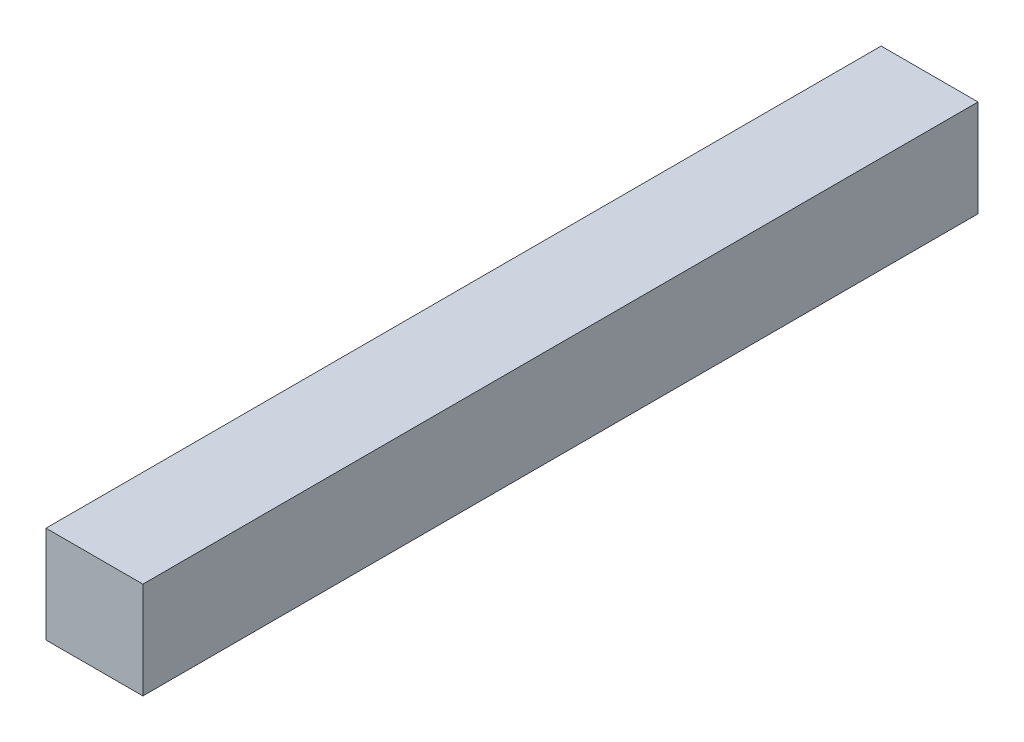
ISO-10303-21;
HEADER;
FILE_DESCRIPTION(('STEP AP214'),'2;1');
FILE_NAME('part.step','',(''),(''),'','','');
FILE_SCHEMA(('AUTOMOTIVE_DESIGN { 1 0 10303 214 1 1 1 1 }'));
ENDSEC;
DATA;
#1=APPLICATION_CONTEXT('core data for automotive mechanical design processes');
#2=APPLICATION_PROTOCOL_DEFINITION('international standard','automotive_design',2000,#1);
#3=PRODUCT_CONTEXT('',#1,'mechanical');
#4=PRODUCT('Part','Part','',(#3));
#5=PRODUCT_RELATED_PRODUCT_CATEGORY('part','',(#4));
#6=PRODUCT_DEFINITION_FORMATION('','',#4);
#7=PRODUCT_DEFINITION_CONTEXT('part definition',#1,'design');
#8=PRODUCT_DEFINITION('design','',#6,#7);
#9=PRODUCT_DEFINITION_SHAPE('','',#8);
#10=(LENGTH_UNIT() NAMED_UNIT(*) SI_UNIT(.MILLI.,.METRE.));
#11=(NAMED_UNIT(*) PLANE_ANGLE_UNIT() SI_UNIT($,.RADIAN.));
#12=(NAMED_UNIT(*) SI_UNIT($,.STERADIAN.) SOLID_ANGLE_UNIT());
#13=UNCERTAINTY_MEASURE_WITH_UNIT(LENGTH_MEASURE(1.E-05),#10,'distance_accuracy_value','');
#14=(GEOMETRIC_REPRESENTATION_CONTEXT(3) GLOBAL_UNCERTAINTY_ASSIGNED_CONTEXT((#13)) GLOBAL_UNIT_ASSIGNED_CONTEXT((#10,
#11,#12)) REPRESENTATION_CONTEXT('',''));
#15=CARTESIAN_POINT('',(0.,0.,0.));
#16=DIRECTION('',(0.,0.,1.));
#17=DIRECTION('',(1.,0.,0.));
#18=AXIS2_PLACEMENT_3D('',#15,#16,#17);
#19=CARTESIAN_POINT('',(3.625,3.625,62.5));
#20=DIRECTION('',(-1.,0.,0.));
#21=DIRECTION('',(0.,-1.,0.));
#22=AXIS2_PLACEMENT_3D('',#19,#20,#21);
#23=PLANE('',#22);
#24=DIRECTION('',(0.,1.,0.));
#25=VECTOR('',#24,1.);
#26=CARTESIAN_POINT('',(3.625,3.625,0.));
#27=LINE('',#26,#25);
#28=CARTESIAN_POINT('',(3.625,-3.625,0.));
#29=VERTEX_POINT('',#28);
#30=CARTESIAN_POINT('',(3.625,3.625,0.));
#31=VERTEX_POINT('',#30);
#32=EDGE_CURVE('E113',#29,#31,#27,.T.);
#33=ORIENTED_EDGE('',*,*,#32,.T.);
#34=DIRECTION('',(0.,0.,-1.));
#35=VECTOR('',#34,1.);
#36=CARTESIAN_POINT('',(3.625,3.625,62.5));
#37=LINE('',#36,#35);
#38=CARTESIAN_POINT('',(3.625,3.625,62.5));
#39=VERTEX_POINT('',#38);
#40=EDGE_CURVE('E11',#39,#31,#37,.T.);
#41=ORIENTED_EDGE('',*,*,#40,.F.);
#42=DIRECTION('',(0.,1.,0.));
#43=VECTOR('',#42,1.);
#44=CARTESIAN_POINT('',(3.625,3.625,62.5));
#45=LINE('',#44,#43);
#46=CARTESIAN_POINT('',(3.625,-3.625,62.5));
#47=VERTEX_POINT('',#46);
#48=EDGE_CURVE('E97',#47,#39,#45,.T.);
#49=ORIENTED_EDGE('',*,*,#48,.F.);
#50=DIRECTION('',(0.,0.,-1.));
#51=VECTOR('',#50,1.);
#52=CARTESIAN_POINT('',(3.625,-3.625,62.5));
#53=LINE('',#52,#51);
#54=EDGE_CURVE('E109',#47,#29,#53,.T.);
#55=ORIENTED_EDGE('',*,*,#54,.T.);
#56=EDGE_LOOP('',(#33,#41,#49,#55));
#57=FACE_BOUND('',#56,.T.);
#58=ADVANCED_FACE('F45',(#57),#23,.F.);
#59=CARTESIAN_POINT('',(-3.625,3.625,62.5));
#60=DIRECTION('',(0.,-1.,0.));
#61=DIRECTION('',(0.,0.,-1.));
#62=AXIS2_PLACEMENT_3D('',#59,#60,#61);
#63=PLANE('',#62);
#64=DIRECTION('',(-1.,0.,0.));
#65=VECTOR('',#64,1.);
#66=CARTESIAN_POINT('',(-3.625,3.625,0.));
#67=LINE('',#66,#65);
#68=CARTESIAN_POINT('',(-3.625,3.625,0.));
#69=VERTEX_POINT('',#68);
#70=EDGE_CURVE('E102',#31,#69,#67,.T.);
#71=ORIENTED_EDGE('',*,*,#70,.T.);
#72=DIRECTION('',(0.,0.,-1.));
#73=VECTOR('',#72,1.);
#74=CARTESIAN_POINT('',(-3.625,3.625,62.5));
#75=LINE('',#74,#73);
#76=CARTESIAN_POINT('',(-3.625,3.625,62.5));
#77=VERTEX_POINT('',#76);
#78=EDGE_CURVE('E54',#77,#69,#75,.T.);
#79=ORIENTED_EDGE('',*,*,#78,.F.);
#80=DIRECTION('',(-1.,0.,0.));
#81=VECTOR('',#80,1.);
#82=CARTESIAN_POINT('',(-3.625,3.625,62.5));
#83=LINE('',#82,#81);
#84=EDGE_CURVE('E92',#39,#77,#83,.T.);
#85=ORIENTED_EDGE('',*,*,#84,.F.);
#86=ORIENTED_EDGE('',*,*,#40,.T.);
#87=EDGE_LOOP('',(#71,#79,#85,#86));
#88=FACE_BOUND('',#87,.T.);
#89=ADVANCED_FACE('F101',(#88),#63,.F.);
#90=CARTESIAN_POINT('',(-3.625,3.625,62.5));
#91=DIRECTION('',(1.,0.,0.));
#92=DIRECTION('',(0.,1.,0.));
#93=AXIS2_PLACEMENT_3D('',#90,#91,#92);
#94=PLANE('',#93);
#95=DIRECTION('',(0.,-1.,0.));
#96=VECTOR('',#95,1.);
#97=CARTESIAN_POINT('',(-3.625,3.625,0.));
#98=LINE('',#97,#96);
#99=CARTESIAN_POINT('',(-3.625,-3.625,0.));
#100=VERTEX_POINT('',#99);
#101=EDGE_CURVE('E79',#69,#100,#98,.T.);
#102=ORIENTED_EDGE('',*,*,#101,.T.);
#103=DIRECTION('',(0.,0.,-1.));
#104=VECTOR('',#103,1.);
#105=CARTESIAN_POINT('',(-3.625,-3.625,62.5));
#106=LINE('',#105,#104);
#107=CARTESIAN_POINT('',(-3.625,-3.625,62.5));
#108=VERTEX_POINT('',#107);
#109=EDGE_CURVE('E104',#108,#100,#106,.T.);
#110=ORIENTED_EDGE('',*,*,#109,.F.);
#111=DIRECTION('',(0.,-1.,0.));
#112=VECTOR('',#111,1.);
#113=CARTESIAN_POINT('',(-3.625,3.625,62.5));
#114=LINE('',#113,#112);
#115=EDGE_CURVE('E95',#77,#108,#114,.T.);
#116=ORIENTED_EDGE('',*,*,#115,.F.);
#117=ORIENTED_EDGE('',*,*,#78,.T.);
#118=EDGE_LOOP('',(#102,#110,#116,#117));
#119=FACE_BOUND('',#118,.T.);
#120=ADVANCED_FACE('F105',(#119),#94,.F.);
#121=CARTESIAN_POINT('',(-3.625,-3.625,62.5));
#122=DIRECTION('',(0.,1.,0.));
#123=DIRECTION('',(0.,0.,1.));
#124=AXIS2_PLACEMENT_3D('',#121,#122,#123);
#125=PLANE('',#124);
#126=DIRECTION('',(1.,0.,0.));
#127=VECTOR('',#126,1.);
#128=CARTESIAN_POINT('',(-3.625,-3.625,0.));
#129=LINE('',#128,#127);
#130=EDGE_CURVE('E85',#100,#29,#129,.T.);
#131=ORIENTED_EDGE('',*,*,#130,.T.);
#132=ORIENTED_EDGE('',*,*,#54,.F.);
#133=DIRECTION('',(1.,0.,0.));
#134=VECTOR('',#133,1.);
#135=CARTESIAN_POINT('',(-3.625,-3.625,62.5));
#136=LINE('',#135,#134);
#137=EDGE_CURVE('E62',#108,#47,#136,.T.);
#138=ORIENTED_EDGE('',*,*,#137,.F.);
#139=ORIENTED_EDGE('',*,*,#109,.T.);
#140=EDGE_LOOP('',(#131,#132,#138,#139));
#141=FACE_BOUND('',#140,.T.);
#142=ADVANCED_FACE('F126',(#141),#125,.F.);
#143=CARTESIAN_POINT('',(0.,0.,62.5));
#144=DIRECTION('',(0.,0.,1.));
#145=DIRECTION('',(1.,0.,0.));
#146=AXIS2_PLACEMENT_3D('',#143,#144,#145);
#147=PLANE('',#146);
#148=ORIENTED_EDGE('',*,*,#48,.T.);
#149=ORIENTED_EDGE('',*,*,#84,.T.);
#150=ORIENTED_EDGE('',*,*,#115,.T.);
#151=ORIENTED_EDGE('',*,*,#137,.T.);
#152=EDGE_LOOP('',(#148,#149,#150,#151));
#153=FACE_BOUND('',#152,.T.);
#154=ADVANCED_FACE('F93',(#153),#147,.T.);
#155=CARTESIAN_POINT('',(0.,0.,0.));
#156=DIRECTION('',(0.,0.,1.));
#157=DIRECTION('',(1.,0.,0.));
#158=AXIS2_PLACEMENT_3D('',#155,#156,#157);
#159=PLANE('',#158);
#160=ORIENTED_EDGE('',*,*,#32,.F.);
#161=ORIENTED_EDGE('',*,*,#130,.F.);
#162=ORIENTED_EDGE('',*,*,#101,.F.);
#163=ORIENTED_EDGE('',*,*,#70,.F.);
#164=EDGE_LOOP('',(#160,#161,#162,#163));
#165=FACE_BOUND('',#164,.T.);
#166=ADVANCED_FACE('F129',(#165),#159,.F.);
#167=CLOSED_SHELL('',(#58,#89,#120,#142,#154,#166));
#168=MANIFOLD_SOLID_BREP('B2',#167);
#169=ADVANCED_BREP_SHAPE_REPRESENTATION('',(#18,#168),#14);
#170=SHAPE_DEFINITION_REPRESENTATION(#9,#169);
ENDSEC;
END-ISO-10303-21;
